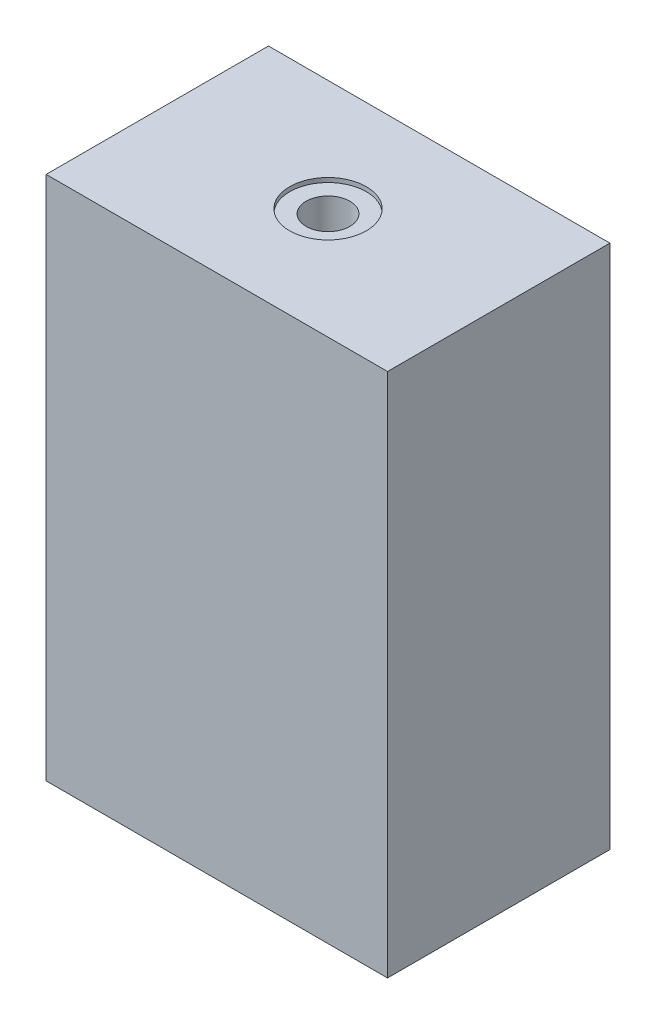
ISO-10303-21;
HEADER;
FILE_DESCRIPTION(('STEP AP214'),'2;1');
FILE_NAME('part.step','',(''),(''),'','','');
FILE_SCHEMA(('AUTOMOTIVE_DESIGN { 1 0 10303 214 1 1 1 1 }'));
ENDSEC;
DATA;
#1=APPLICATION_CONTEXT('core data for automotive mechanical design processes');
#2=APPLICATION_PROTOCOL_DEFINITION('international standard','automotive_design',2000,#1);
#3=PRODUCT_CONTEXT('',#1,'mechanical');
#4=PRODUCT('Part','Part','',(#3));
#5=PRODUCT_RELATED_PRODUCT_CATEGORY('part','',(#4));
#6=PRODUCT_DEFINITION_FORMATION('','',#4);
#7=PRODUCT_DEFINITION_CONTEXT('part definition',#1,'design');
#8=PRODUCT_DEFINITION('design','',#6,#7);
#9=PRODUCT_DEFINITION_SHAPE('','',#8);
#10=(LENGTH_UNIT() NAMED_UNIT(*) SI_UNIT(.MILLI.,.METRE.));
#11=(NAMED_UNIT(*) PLANE_ANGLE_UNIT() SI_UNIT($,.RADIAN.));
#12=(NAMED_UNIT(*) SI_UNIT($,.STERADIAN.) SOLID_ANGLE_UNIT());
#13=UNCERTAINTY_MEASURE_WITH_UNIT(LENGTH_MEASURE(1.E-05),#10,'distance_accuracy_value','');
#14=(GEOMETRIC_REPRESENTATION_CONTEXT(3) GLOBAL_UNCERTAINTY_ASSIGNED_CONTEXT((#13)) GLOBAL_UNIT_ASSIGNED_CONTEXT((#10,
#11,#12)) REPRESENTATION_CONTEXT('',''));
#15=CARTESIAN_POINT('',(0.,0.,0.));
#16=DIRECTION('',(0.,0.,1.));
#17=DIRECTION('',(1.,0.,0.));
#18=AXIS2_PLACEMENT_3D('',#15,#16,#17);
#19=CARTESIAN_POINT('',(0.,0.,0.));
#20=DIRECTION('',(0.,1.,0.));
#21=DIRECTION('',(0.,0.,1.));
#22=AXIS2_PLACEMENT_3D('',#19,#20,#21);
#23=CYLINDRICAL_SURFACE('',#22,0.5);
#24=CARTESIAN_POINT('',(0.,0.,0.));
#25=DIRECTION('',(0.,1.,0.));
#26=DIRECTION('',(0.,0.,1.));
#27=AXIS2_PLACEMENT_3D('',#24,#25,#26);
#28=CIRCLE('',#27,0.5);
#29=CARTESIAN_POINT('',(0.,0.,0.5));
#30=VERTEX_POINT('',#29);
#31=EDGE_CURVE('E202',#30,#30,#28,.T.);
#32=ORIENTED_EDGE('',*,*,#31,.F.);
#33=EDGE_LOOP('',(#32));
#34=FACE_BOUND('',#33,.T.);
#35=CARTESIAN_POINT('',(0.,11.9,0.));
#36=DIRECTION('',(0.,1.,0.));
#37=DIRECTION('',(0.,0.,1.));
#38=AXIS2_PLACEMENT_3D('',#35,#36,#37);
#39=CIRCLE('',#38,0.5);
#40=CARTESIAN_POINT('',(0.,11.9,0.5));
#41=VERTEX_POINT('',#40);
#42=EDGE_CURVE('E41',#41,#41,#39,.F.);
#43=ORIENTED_EDGE('',*,*,#42,.F.);
#44=EDGE_LOOP('',(#43));
#45=FACE_BOUND('',#44,.T.);
#46=ADVANCED_FACE('F37',(#34,#45),#23,.F.);
#47=CARTESIAN_POINT('',(-3.9,12.,-2.54));
#48=DIRECTION('',(1.,0.,0.));
#49=DIRECTION('',(0.,0.,-1.));
#50=AXIS2_PLACEMENT_3D('',#47,#48,#49);
#51=PLANE('',#50);
#52=DIRECTION('',(0.,0.,1.));
#53=VECTOR('',#52,1.);
#54=CARTESIAN_POINT('',(-3.9,0.,-2.54));
#55=LINE('',#54,#53);
#56=CARTESIAN_POINT('',(-3.9,0.,-2.54));
#57=VERTEX_POINT('',#56);
#58=CARTESIAN_POINT('',(-3.9,0.,2.54));
#59=VERTEX_POINT('',#58);
#60=EDGE_CURVE('E205',#57,#59,#55,.T.);
#61=ORIENTED_EDGE('',*,*,#60,.T.);
#62=DIRECTION('',(0.,-1.,0.));
#63=VECTOR('',#62,1.);
#64=CARTESIAN_POINT('',(-3.9,12.,2.54));
#65=LINE('',#64,#63);
#66=CARTESIAN_POINT('',(-3.9,12.,2.54));
#67=VERTEX_POINT('',#66);
#68=EDGE_CURVE('E12',#67,#59,#65,.T.);
#69=ORIENTED_EDGE('',*,*,#68,.F.);
#70=DIRECTION('',(0.,0.,1.));
#71=VECTOR('',#70,1.);
#72=CARTESIAN_POINT('',(-3.9,12.,-2.54));
#73=LINE('',#72,#71);
#74=CARTESIAN_POINT('',(-3.9,12.,-2.54));
#75=VERTEX_POINT('',#74);
#76=EDGE_CURVE('E206',#75,#67,#73,.T.);
#77=ORIENTED_EDGE('',*,*,#76,.F.);
#78=DIRECTION('',(0.,-1.,0.));
#79=VECTOR('',#78,1.);
#80=CARTESIAN_POINT('',(-3.9,12.,-2.54));
#81=LINE('',#80,#79);
#82=EDGE_CURVE('E216',#75,#57,#81,.T.);
#83=ORIENTED_EDGE('',*,*,#82,.T.);
#84=EDGE_LOOP('',(#61,#69,#77,#83));
#85=FACE_BOUND('',#84,.T.);
#86=ADVANCED_FACE('F39',(#85),#51,.F.);
#87=CARTESIAN_POINT('',(-3.9,12.,2.54));
#88=DIRECTION('',(0.,0.,-1.));
#89=DIRECTION('',(-1.,0.,0.));
#90=AXIS2_PLACEMENT_3D('',#87,#88,#89);
#91=PLANE('',#90);
#92=DIRECTION('',(1.,0.,0.));
#93=VECTOR('',#92,1.);
#94=CARTESIAN_POINT('',(-3.9,0.,2.54));
#95=LINE('',#94,#93);
#96=CARTESIAN_POINT('',(3.9,0.,2.54));
#97=VERTEX_POINT('',#96);
#98=EDGE_CURVE('E219',#59,#97,#95,.T.);
#99=ORIENTED_EDGE('',*,*,#98,.T.);
#100=DIRECTION('',(0.,-1.,0.));
#101=VECTOR('',#100,1.);
#102=CARTESIAN_POINT('',(3.9,12.,2.54));
#103=LINE('',#102,#101);
#104=CARTESIAN_POINT('',(3.9,12.,2.54));
#105=VERTEX_POINT('',#104);
#106=EDGE_CURVE('E46',#105,#97,#103,.T.);
#107=ORIENTED_EDGE('',*,*,#106,.F.);
#108=DIRECTION('',(1.,0.,0.));
#109=VECTOR('',#108,1.);
#110=CARTESIAN_POINT('',(-3.9,12.,2.54));
#111=LINE('',#110,#109);
#112=EDGE_CURVE('E209',#67,#105,#111,.T.);
#113=ORIENTED_EDGE('',*,*,#112,.F.);
#114=ORIENTED_EDGE('',*,*,#68,.T.);
#115=EDGE_LOOP('',(#99,#107,#113,#114));
#116=FACE_BOUND('',#115,.T.);
#117=ADVANCED_FACE('F250',(#116),#91,.F.);
#118=CARTESIAN_POINT('',(3.9,12.,-2.54));
#119=DIRECTION('',(-1.,0.,0.));
#120=DIRECTION('',(0.,0.,1.));
#121=AXIS2_PLACEMENT_3D('',#118,#119,#120);
#122=PLANE('',#121);
#123=DIRECTION('',(0.,0.,-1.));
#124=VECTOR('',#123,1.);
#125=CARTESIAN_POINT('',(3.9,0.,-2.54));
#126=LINE('',#125,#124);
#127=CARTESIAN_POINT('',(3.9,0.,-2.54));
#128=VERTEX_POINT('',#127);
#129=EDGE_CURVE('E221',#97,#128,#126,.T.);
#130=ORIENTED_EDGE('',*,*,#129,.T.);
#131=DIRECTION('',(0.,-1.,0.));
#132=VECTOR('',#131,1.);
#133=CARTESIAN_POINT('',(3.9,12.,-2.54));
#134=LINE('',#133,#132);
#135=CARTESIAN_POINT('',(3.9,12.,-2.54));
#136=VERTEX_POINT('',#135);
#137=EDGE_CURVE('E226',#136,#128,#134,.T.);
#138=ORIENTED_EDGE('',*,*,#137,.F.);
#139=DIRECTION('',(0.,0.,-1.));
#140=VECTOR('',#139,1.);
#141=CARTESIAN_POINT('',(3.9,12.,-2.54));
#142=LINE('',#141,#140);
#143=EDGE_CURVE('E212',#105,#136,#142,.T.);
#144=ORIENTED_EDGE('',*,*,#143,.F.);
#145=ORIENTED_EDGE('',*,*,#106,.T.);
#146=EDGE_LOOP('',(#130,#138,#144,#145));
#147=FACE_BOUND('',#146,.T.);
#148=ADVANCED_FACE('F234',(#147),#122,.F.);
#149=CARTESIAN_POINT('',(-3.9,12.,-2.54));
#150=DIRECTION('',(0.,0.,1.));
#151=DIRECTION('',(1.,0.,0.));
#152=AXIS2_PLACEMENT_3D('',#149,#150,#151);
#153=PLANE('',#152);
#154=DIRECTION('',(-1.,0.,0.));
#155=VECTOR('',#154,1.);
#156=CARTESIAN_POINT('',(-3.9,0.,-2.54));
#157=LINE('',#156,#155);
#158=EDGE_CURVE('E210',#128,#57,#157,.T.);
#159=ORIENTED_EDGE('',*,*,#158,.T.);
#160=ORIENTED_EDGE('',*,*,#82,.F.);
#161=DIRECTION('',(-1.,0.,0.));
#162=VECTOR('',#161,1.);
#163=CARTESIAN_POINT('',(-3.9,12.,-2.54));
#164=LINE('',#163,#162);
#165=EDGE_CURVE('E214',#136,#75,#164,.T.);
#166=ORIENTED_EDGE('',*,*,#165,.F.);
#167=ORIENTED_EDGE('',*,*,#137,.T.);
#168=EDGE_LOOP('',(#159,#160,#166,#167));
#169=FACE_BOUND('',#168,.T.);
#170=ADVANCED_FACE('F243',(#169),#153,.F.);
#171=CARTESIAN_POINT('',(-3.9,12.,-2.54));
#172=DIRECTION('',(0.,1.,0.));
#173=DIRECTION('',(0.,0.,1.));
#174=AXIS2_PLACEMENT_3D('',#171,#172,#173);
#175=PLANE('',#174);
#176=CARTESIAN_POINT('',(0.,12.,0.));
#177=DIRECTION('',(0.,1.,0.));
#178=DIRECTION('',(0.,0.,1.));
#179=AXIS2_PLACEMENT_3D('',#176,#177,#178);
#180=CIRCLE('',#179,0.875);
#181=CARTESIAN_POINT('',(0.,12.,0.875));
#182=VERTEX_POINT('',#181);
#183=EDGE_CURVE('E196',#182,#182,#180,.T.);
#184=ORIENTED_EDGE('',*,*,#183,.F.);
#185=EDGE_LOOP('',(#184));
#186=FACE_BOUND('',#185,.T.);
#187=ORIENTED_EDGE('',*,*,#76,.T.);
#188=ORIENTED_EDGE('',*,*,#112,.T.);
#189=ORIENTED_EDGE('',*,*,#143,.T.);
#190=ORIENTED_EDGE('',*,*,#165,.T.);
#191=EDGE_LOOP('',(#187,#188,#189,#190));
#192=FACE_BOUND('',#191,.T.);
#193=ADVANCED_FACE('F249',(#186,#192),#175,.T.);
#194=CARTESIAN_POINT('',(-3.9,0.,-2.54));
#195=DIRECTION('',(0.,1.,0.));
#196=DIRECTION('',(0.,0.,1.));
#197=AXIS2_PLACEMENT_3D('',#194,#195,#196);
#198=PLANE('',#197);
#199=DIRECTION('',(1.,0.,0.));
#200=VECTOR('',#199,1.);
#201=CARTESIAN_POINT('',(3.4,0.,-0.999999999999999));
#202=LINE('',#201,#200);
#203=CARTESIAN_POINT('',(1.9,0.,-1.));
#204=VERTEX_POINT('',#203);
#205=CARTESIAN_POINT('',(3.4,0.,-0.999999999999999));
#206=VERTEX_POINT('',#205);
#207=EDGE_CURVE('E152',#204,#206,#202,.T.);
#208=ORIENTED_EDGE('',*,*,#207,.F.);
#209=DIRECTION('',(0.,0.,-1.));
#210=VECTOR('',#209,1.);
#211=CARTESIAN_POINT('',(1.9,0.,1.));
#212=LINE('',#211,#210);
#213=CARTESIAN_POINT('',(1.9,0.,1.));
#214=VERTEX_POINT('',#213);
#215=EDGE_CURVE('E145',#214,#204,#212,.T.);
#216=ORIENTED_EDGE('',*,*,#215,.F.);
#217=DIRECTION('',(-1.,0.,0.));
#218=VECTOR('',#217,1.);
#219=CARTESIAN_POINT('',(3.4,0.,0.999999999999999));
#220=LINE('',#219,#218);
#221=CARTESIAN_POINT('',(3.4,0.,0.999999999999999));
#222=VERTEX_POINT('',#221);
#223=EDGE_CURVE('E156',#222,#214,#220,.T.);
#224=ORIENTED_EDGE('',*,*,#223,.F.);
#225=DIRECTION('',(0.,0.,1.));
#226=VECTOR('',#225,1.);
#227=CARTESIAN_POINT('',(3.4,0.,0.999999999999999));
#228=LINE('',#227,#226);
#229=EDGE_CURVE('E53',#206,#222,#228,.T.);
#230=ORIENTED_EDGE('',*,*,#229,.F.);
#231=EDGE_LOOP('',(#208,#216,#224,#230));
#232=FACE_BOUND('',#231,.T.);
#233=DIRECTION('',(0.,0.,1.));
#234=VECTOR('',#233,1.);
#235=CARTESIAN_POINT('',(-1.9,0.,1.));
#236=LINE('',#235,#234);
#237=CARTESIAN_POINT('',(-1.9,0.,-1.));
#238=VERTEX_POINT('',#237);
#239=CARTESIAN_POINT('',(-1.9,0.,1.));
#240=VERTEX_POINT('',#239);
#241=EDGE_CURVE('E169',#238,#240,#236,.T.);
#242=ORIENTED_EDGE('',*,*,#241,.F.);
#243=DIRECTION('',(1.,0.,0.));
#244=VECTOR('',#243,1.);
#245=CARTESIAN_POINT('',(-3.4,0.,-1.));
#246=LINE('',#245,#244);
#247=CARTESIAN_POINT('',(-3.4,0.,-1.));
#248=VERTEX_POINT('',#247);
#249=EDGE_CURVE('E172',#248,#238,#246,.T.);
#250=ORIENTED_EDGE('',*,*,#249,.F.);
#251=DIRECTION('',(0.,0.,-1.));
#252=VECTOR('',#251,1.);
#253=CARTESIAN_POINT('',(-3.4,0.,1.));
#254=LINE('',#253,#252);
#255=CARTESIAN_POINT('',(-3.4,0.,1.));
#256=VERTEX_POINT('',#255);
#257=EDGE_CURVE('E166',#256,#248,#254,.T.);
#258=ORIENTED_EDGE('',*,*,#257,.F.);
#259=DIRECTION('',(-1.,0.,0.));
#260=VECTOR('',#259,1.);
#261=CARTESIAN_POINT('',(-3.4,0.,1.));
#262=LINE('',#261,#260);
#263=EDGE_CURVE('E61',#240,#256,#262,.T.);
#264=ORIENTED_EDGE('',*,*,#263,.F.);
#265=EDGE_LOOP('',(#242,#250,#258,#264));
#266=FACE_BOUND('',#265,.T.);
#267=ORIENTED_EDGE('',*,*,#31,.T.);
#268=EDGE_LOOP('',(#267));
#269=FACE_BOUND('',#268,.T.);
#270=ORIENTED_EDGE('',*,*,#60,.F.);
#271=ORIENTED_EDGE('',*,*,#158,.F.);
#272=ORIENTED_EDGE('',*,*,#129,.F.);
#273=ORIENTED_EDGE('',*,*,#98,.F.);
#274=EDGE_LOOP('',(#270,#271,#272,#273));
#275=FACE_BOUND('',#274,.T.);
#276=ADVANCED_FACE('F240',(#232,#266,#269,#275),#198,.F.);
#277=CARTESIAN_POINT('',(0.,11.9,0.));
#278=DIRECTION('',(0.,1.,0.));
#279=DIRECTION('',(0.,0.,1.));
#280=AXIS2_PLACEMENT_3D('',#277,#278,#279);
#281=PLANE('',#280);
#282=CARTESIAN_POINT('',(0.,11.9,0.));
#283=DIRECTION('',(0.,1.,0.));
#284=DIRECTION('',(0.,0.,1.));
#285=AXIS2_PLACEMENT_3D('',#282,#283,#284);
#286=CIRCLE('',#285,0.875);
#287=CARTESIAN_POINT('',(0.,11.9,0.875));
#288=VERTEX_POINT('',#287);
#289=EDGE_CURVE('E197',#288,#288,#286,.T.);
#290=ORIENTED_EDGE('',*,*,#289,.T.);
#291=EDGE_LOOP('',(#290));
#292=FACE_BOUND('',#291,.T.);
#293=ORIENTED_EDGE('',*,*,#42,.T.);
#294=EDGE_LOOP('',(#293));
#295=FACE_BOUND('',#294,.T.);
#296=ADVANCED_FACE('F273',(#292,#295),#281,.T.);
#297=CARTESIAN_POINT('',(0.,11.9,0.));
#298=DIRECTION('',(0.,1.,0.));
#299=DIRECTION('',(0.,0.,1.));
#300=AXIS2_PLACEMENT_3D('',#297,#298,#299);
#301=CYLINDRICAL_SURFACE('',#300,0.875);
#302=ORIENTED_EDGE('',*,*,#289,.F.);
#303=EDGE_LOOP('',(#302));
#304=FACE_BOUND('',#303,.T.);
#305=ORIENTED_EDGE('',*,*,#183,.T.);
#306=EDGE_LOOP('',(#305));
#307=FACE_BOUND('',#306,.T.);
#308=ADVANCED_FACE('F266',(#304,#307),#301,.F.);
#309=CARTESIAN_POINT('',(-3.9,10.,-2.54));
#310=DIRECTION('',(0.,1.,0.));
#311=DIRECTION('',(0.,0.,1.));
#312=AXIS2_PLACEMENT_3D('',#309,#310,#311);
#313=PLANE('',#312);
#314=DIRECTION('',(0.,0.,-1.));
#315=VECTOR('',#314,1.);
#316=CARTESIAN_POINT('',(-3.4,10.,1.));
#317=LINE('',#316,#315);
#318=CARTESIAN_POINT('',(-3.4,10.,1.));
#319=VERTEX_POINT('',#318);
#320=CARTESIAN_POINT('',(-3.4,10.,-1.));
#321=VERTEX_POINT('',#320);
#322=EDGE_CURVE('E180',#319,#321,#317,.T.);
#323=ORIENTED_EDGE('',*,*,#322,.T.);
#324=DIRECTION('',(1.,0.,0.));
#325=VECTOR('',#324,1.);
#326=CARTESIAN_POINT('',(-3.4,10.,-1.));
#327=LINE('',#326,#325);
#328=CARTESIAN_POINT('',(-1.9,10.,-1.));
#329=VERTEX_POINT('',#328);
#330=EDGE_CURVE('E168',#321,#329,#327,.T.);
#331=ORIENTED_EDGE('',*,*,#330,.T.);
#332=DIRECTION('',(0.,0.,1.));
#333=VECTOR('',#332,1.);
#334=CARTESIAN_POINT('',(-1.9,10.,1.));
#335=LINE('',#334,#333);
#336=CARTESIAN_POINT('',(-1.9,10.,1.));
#337=VERTEX_POINT('',#336);
#338=EDGE_CURVE('E189',#329,#337,#335,.T.);
#339=ORIENTED_EDGE('',*,*,#338,.T.);
#340=DIRECTION('',(-1.,0.,0.));
#341=VECTOR('',#340,1.);
#342=CARTESIAN_POINT('',(-3.4,10.,1.));
#343=LINE('',#342,#341);
#344=EDGE_CURVE('E185',#337,#319,#343,.T.);
#345=ORIENTED_EDGE('',*,*,#344,.T.);
#346=EDGE_LOOP('',(#323,#331,#339,#345));
#347=FACE_BOUND('',#346,.T.);
#348=ADVANCED_FACE('F301',(#347),#313,.F.);
#349=CARTESIAN_POINT('',(-3.4,14.5,-1.));
#350=DIRECTION('',(0.,0.,-1.));
#351=DIRECTION('',(-1.,0.,0.));
#352=AXIS2_PLACEMENT_3D('',#349,#350,#351);
#353=PLANE('',#352);
#354=DIRECTION('',(0.,-1.,0.));
#355=VECTOR('',#354,1.);
#356=CARTESIAN_POINT('',(-3.4,14.5,-1.));
#357=LINE('',#356,#355);
#358=EDGE_CURVE('E183',#321,#248,#357,.T.);
#359=ORIENTED_EDGE('',*,*,#358,.T.);
#360=ORIENTED_EDGE('',*,*,#249,.T.);
#361=DIRECTION('',(0.,-1.,0.));
#362=VECTOR('',#361,1.);
#363=CARTESIAN_POINT('',(-1.9,14.5,-1.));
#364=LINE('',#363,#362);
#365=EDGE_CURVE('E179',#329,#238,#364,.T.);
#366=ORIENTED_EDGE('',*,*,#365,.F.);
#367=ORIENTED_EDGE('',*,*,#330,.F.);
#368=EDGE_LOOP('',(#359,#360,#366,#367));
#369=FACE_BOUND('',#368,.T.);
#370=ADVANCED_FACE('F307',(#369),#353,.F.);
#371=CARTESIAN_POINT('',(-1.9,14.5,1.));
#372=DIRECTION('',(1.,0.,0.));
#373=DIRECTION('',(0.,0.,-1.));
#374=AXIS2_PLACEMENT_3D('',#371,#372,#373);
#375=PLANE('',#374);
#376=ORIENTED_EDGE('',*,*,#365,.T.);
#377=ORIENTED_EDGE('',*,*,#241,.T.);
#378=DIRECTION('',(0.,-1.,0.));
#379=VECTOR('',#378,1.);
#380=CARTESIAN_POINT('',(-1.9,14.5,1.));
#381=LINE('',#380,#379);
#382=EDGE_CURVE('E188',#337,#240,#381,.T.);
#383=ORIENTED_EDGE('',*,*,#382,.F.);
#384=ORIENTED_EDGE('',*,*,#338,.F.);
#385=EDGE_LOOP('',(#376,#377,#383,#384));
#386=FACE_BOUND('',#385,.T.);
#387=ADVANCED_FACE('F315',(#386),#375,.F.);
#388=CARTESIAN_POINT('',(-3.4,14.5,1.));
#389=DIRECTION('',(0.,0.,1.));
#390=DIRECTION('',(1.,0.,0.));
#391=AXIS2_PLACEMENT_3D('',#388,#389,#390);
#392=PLANE('',#391);
#393=ORIENTED_EDGE('',*,*,#382,.T.);
#394=ORIENTED_EDGE('',*,*,#263,.T.);
#395=DIRECTION('',(0.,-1.,0.));
#396=VECTOR('',#395,1.);
#397=CARTESIAN_POINT('',(-3.4,14.5,1.));
#398=LINE('',#397,#396);
#399=EDGE_CURVE('E184',#319,#256,#398,.T.);
#400=ORIENTED_EDGE('',*,*,#399,.F.);
#401=ORIENTED_EDGE('',*,*,#344,.F.);
#402=EDGE_LOOP('',(#393,#394,#400,#401));
#403=FACE_BOUND('',#402,.T.);
#404=ADVANCED_FACE('F323',(#403),#392,.F.);
#405=CARTESIAN_POINT('',(-3.4,14.5,1.));
#406=DIRECTION('',(-1.,0.,0.));
#407=DIRECTION('',(0.,0.,1.));
#408=AXIS2_PLACEMENT_3D('',#405,#406,#407);
#409=PLANE('',#408);
#410=ORIENTED_EDGE('',*,*,#399,.T.);
#411=ORIENTED_EDGE('',*,*,#257,.T.);
#412=ORIENTED_EDGE('',*,*,#358,.F.);
#413=ORIENTED_EDGE('',*,*,#322,.F.);
#414=EDGE_LOOP('',(#410,#411,#412,#413));
#415=FACE_BOUND('',#414,.T.);
#416=ADVANCED_FACE('F331',(#415),#409,.F.);
#417=CARTESIAN_POINT('',(-3.9,10.,-2.54));
#418=DIRECTION('',(0.,1.,0.));
#419=DIRECTION('',(0.,0.,1.));
#420=AXIS2_PLACEMENT_3D('',#417,#418,#419);
#421=PLANE('',#420);
#422=DIRECTION('',(-1.,0.,0.));
#423=VECTOR('',#422,1.);
#424=CARTESIAN_POINT('',(3.4,10.,0.999999999999999));
#425=LINE('',#424,#423);
#426=CARTESIAN_POINT('',(3.4,10.,0.999999999999999));
#427=VERTEX_POINT('',#426);
#428=CARTESIAN_POINT('',(1.9,10.,1.));
#429=VERTEX_POINT('',#428);
#430=EDGE_CURVE('E149',#427,#429,#425,.T.);
#431=ORIENTED_EDGE('',*,*,#430,.T.);
#432=DIRECTION('',(0.,0.,-1.));
#433=VECTOR('',#432,1.);
#434=CARTESIAN_POINT('',(1.9,10.,1.));
#435=LINE('',#434,#433);
#436=CARTESIAN_POINT('',(1.9,10.,-1.));
#437=VERTEX_POINT('',#436);
#438=EDGE_CURVE('E142',#429,#437,#435,.T.);
#439=ORIENTED_EDGE('',*,*,#438,.T.);
#440=DIRECTION('',(1.,0.,0.));
#441=VECTOR('',#440,1.);
#442=CARTESIAN_POINT('',(3.4,10.,-0.999999999999999));
#443=LINE('',#442,#441);
#444=CARTESIAN_POINT('',(3.4,10.,-0.999999999999999));
#445=VERTEX_POINT('',#444);
#446=EDGE_CURVE('E129',#437,#445,#443,.T.);
#447=ORIENTED_EDGE('',*,*,#446,.T.);
#448=DIRECTION('',(0.,0.,1.));
#449=VECTOR('',#448,1.);
#450=CARTESIAN_POINT('',(3.4,10.,0.999999999999999));
#451=LINE('',#450,#449);
#452=EDGE_CURVE('E161',#445,#427,#451,.T.);
#453=ORIENTED_EDGE('',*,*,#452,.T.);
#454=EDGE_LOOP('',(#431,#439,#447,#453));
#455=FACE_BOUND('',#454,.T.);
#456=ADVANCED_FACE('F148',(#455),#421,.F.);
#457=CARTESIAN_POINT('',(1.9,14.5,1.));
#458=DIRECTION('',(-1.,0.,0.));
#459=DIRECTION('',(0.,0.,1.));
#460=AXIS2_PLACEMENT_3D('',#457,#458,#459);
#461=PLANE('',#460);
#462=DIRECTION('',(0.,-1.,0.));
#463=VECTOR('',#462,1.);
#464=CARTESIAN_POINT('',(1.9,14.5,1.));
#465=LINE('',#464,#463);
#466=EDGE_CURVE('E159',#429,#214,#465,.T.);
#467=ORIENTED_EDGE('',*,*,#466,.T.);
#468=ORIENTED_EDGE('',*,*,#215,.T.);
#469=DIRECTION('',(0.,-1.,0.));
#470=VECTOR('',#469,1.);
#471=CARTESIAN_POINT('',(1.9,14.5,-1.));
#472=LINE('',#471,#470);
#473=EDGE_CURVE('E133',#437,#204,#472,.T.);
#474=ORIENTED_EDGE('',*,*,#473,.F.);
#475=ORIENTED_EDGE('',*,*,#438,.F.);
#476=EDGE_LOOP('',(#467,#468,#474,#475));
#477=FACE_BOUND('',#476,.T.);
#478=ADVANCED_FACE('F141',(#477),#461,.F.);
#479=CARTESIAN_POINT('',(3.4,14.5,-0.999999999999999));
#480=DIRECTION('',(0.,0.,-1.));
#481=DIRECTION('',(-1.,0.,0.));
#482=AXIS2_PLACEMENT_3D('',#479,#480,#481);
#483=PLANE('',#482);
#484=ORIENTED_EDGE('',*,*,#473,.T.);
#485=ORIENTED_EDGE('',*,*,#207,.T.);
#486=DIRECTION('',(0.,-1.,0.));
#487=VECTOR('',#486,1.);
#488=CARTESIAN_POINT('',(3.4,14.5,-0.999999999999999));
#489=LINE('',#488,#487);
#490=EDGE_CURVE('E135',#445,#206,#489,.T.);
#491=ORIENTED_EDGE('',*,*,#490,.F.);
#492=ORIENTED_EDGE('',*,*,#446,.F.);
#493=EDGE_LOOP('',(#484,#485,#491,#492));
#494=FACE_BOUND('',#493,.T.);
#495=ADVANCED_FACE('F131',(#494),#483,.F.);
#496=CARTESIAN_POINT('',(3.4,14.5,0.999999999999999));
#497=DIRECTION('',(1.,0.,0.));
#498=DIRECTION('',(0.,0.,-1.));
#499=AXIS2_PLACEMENT_3D('',#496,#497,#498);
#500=PLANE('',#499);
#501=ORIENTED_EDGE('',*,*,#490,.T.);
#502=ORIENTED_EDGE('',*,*,#229,.T.);
#503=DIRECTION('',(0.,-1.,0.));
#504=VECTOR('',#503,1.);
#505=CARTESIAN_POINT('',(3.4,14.5,0.999999999999999));
#506=LINE('',#505,#504);
#507=EDGE_CURVE('E160',#427,#222,#506,.T.);
#508=ORIENTED_EDGE('',*,*,#507,.F.);
#509=ORIENTED_EDGE('',*,*,#452,.F.);
#510=EDGE_LOOP('',(#501,#502,#508,#509));
#511=FACE_BOUND('',#510,.T.);
#512=ADVANCED_FACE('F357',(#511),#500,.F.);
#513=CARTESIAN_POINT('',(3.4,14.5,0.999999999999999));
#514=DIRECTION('',(0.,0.,1.));
#515=DIRECTION('',(1.,0.,0.));
#516=AXIS2_PLACEMENT_3D('',#513,#514,#515);
#517=PLANE('',#516);
#518=ORIENTED_EDGE('',*,*,#507,.T.);
#519=ORIENTED_EDGE('',*,*,#223,.T.);
#520=ORIENTED_EDGE('',*,*,#466,.F.);
#521=ORIENTED_EDGE('',*,*,#430,.F.);
#522=EDGE_LOOP('',(#518,#519,#520,#521));
#523=FACE_BOUND('',#522,.T.);
#524=ADVANCED_FACE('F364',(#523),#517,.F.);
#525=CLOSED_SHELL('',(#46,#86,#117,#148,#170,#193,#276,#296,#308,#348,#370,#387,#404,#416,#456,
#478,#495,#512,#524));
#526=MANIFOLD_SOLID_BREP('B2',#525);
#527=ADVANCED_BREP_SHAPE_REPRESENTATION('',(#18,#526),#14);
#528=SHAPE_DEFINITION_REPRESENTATION(#9,#527);
ENDSEC;
END-ISO-10303-21;
